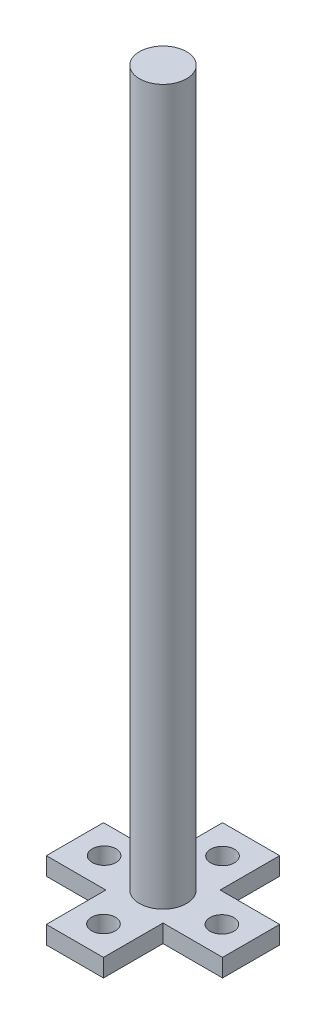
ISO-10303-21;
HEADER;
FILE_DESCRIPTION(('STEP AP214'),'2;1');
FILE_NAME('part.step','',(''),(''),'','','');
FILE_SCHEMA(('AUTOMOTIVE_DESIGN { 1 0 10303 214 1 1 1 1 }'));
ENDSEC;
DATA;
#1=APPLICATION_CONTEXT('core data for automotive mechanical design processes');
#2=APPLICATION_PROTOCOL_DEFINITION('international standard','automotive_design',2000,#1);
#3=PRODUCT_CONTEXT('',#1,'mechanical');
#4=PRODUCT('Part','Part','',(#3));
#5=PRODUCT_RELATED_PRODUCT_CATEGORY('part','',(#4));
#6=PRODUCT_DEFINITION_FORMATION('','',#4);
#7=PRODUCT_DEFINITION_CONTEXT('part definition',#1,'design');
#8=PRODUCT_DEFINITION('design','',#6,#7);
#9=PRODUCT_DEFINITION_SHAPE('','',#8);
#10=(LENGTH_UNIT() NAMED_UNIT(*) SI_UNIT(.MILLI.,.METRE.));
#11=(NAMED_UNIT(*) PLANE_ANGLE_UNIT() SI_UNIT($,.RADIAN.));
#12=(NAMED_UNIT(*) SI_UNIT($,.STERADIAN.) SOLID_ANGLE_UNIT());
#13=UNCERTAINTY_MEASURE_WITH_UNIT(LENGTH_MEASURE(1.E-05),#10,'distance_accuracy_value','');
#14=(GEOMETRIC_REPRESENTATION_CONTEXT(3) GLOBAL_UNCERTAINTY_ASSIGNED_CONTEXT((#13)) GLOBAL_UNIT_ASSIGNED_CONTEXT((#10,
#11,#12)) REPRESENTATION_CONTEXT('',''));
#15=CARTESIAN_POINT('',(0.,0.,0.));
#16=DIRECTION('',(0.,0.,1.));
#17=DIRECTION('',(1.,0.,0.));
#18=AXIS2_PLACEMENT_3D('',#15,#16,#17);
#19=CARTESIAN_POINT('',(-14.8,3.,0.));
#20=DIRECTION('',(-1.,0.,0.));
#21=DIRECTION('',(0.,0.,1.));
#22=AXIS2_PLACEMENT_3D('',#19,#20,#21);
#23=PLANE('',#22);
#24=DIRECTION('',(0.,0.,-1.));
#25=VECTOR('',#24,1.);
#26=CARTESIAN_POINT('',(-14.8,0.,0.));
#27=LINE('',#26,#25);
#28=CARTESIAN_POINT('',(-14.8,0.,4.8));
#29=VERTEX_POINT('',#28);
#30=CARTESIAN_POINT('',(-14.8,0.,-4.8));
#31=VERTEX_POINT('',#30);
#32=EDGE_CURVE('E188',#29,#31,#27,.T.);
#33=ORIENTED_EDGE('',*,*,#32,.F.);
#34=DIRECTION('',(0.,-1.,0.));
#35=VECTOR('',#34,1.);
#36=CARTESIAN_POINT('',(-14.8,3.,4.8));
#37=LINE('',#36,#35);
#38=CARTESIAN_POINT('',(-14.8,3.,4.8));
#39=VERTEX_POINT('',#38);
#40=EDGE_CURVE('E11',#39,#29,#37,.T.);
#41=ORIENTED_EDGE('',*,*,#40,.F.);
#42=DIRECTION('',(0.,0.,-1.));
#43=VECTOR('',#42,1.);
#44=CARTESIAN_POINT('',(-14.8,3.,0.));
#45=LINE('',#44,#43);
#46=CARTESIAN_POINT('',(-14.8,3.,-4.8));
#47=VERTEX_POINT('',#46);
#48=EDGE_CURVE('E301',#39,#47,#45,.T.);
#49=ORIENTED_EDGE('',*,*,#48,.T.);
#50=DIRECTION('',(0.,-1.,0.));
#51=VECTOR('',#50,1.);
#52=CARTESIAN_POINT('',(-14.8,3.,-4.8));
#53=LINE('',#52,#51);
#54=EDGE_CURVE('E65',#47,#31,#53,.T.);
#55=ORIENTED_EDGE('',*,*,#54,.T.);
#56=EDGE_LOOP('',(#33,#41,#49,#55));
#57=FACE_BOUND('',#56,.T.);
#58=ADVANCED_FACE('F47',(#57),#23,.T.);
#59=CARTESIAN_POINT('',(0.,3.,4.8));
#60=DIRECTION('',(0.,0.,-1.));
#61=DIRECTION('',(-1.,0.,0.));
#62=AXIS2_PLACEMENT_3D('',#59,#60,#61);
#63=PLANE('',#62);
#64=DIRECTION('',(1.,0.,0.));
#65=VECTOR('',#64,1.);
#66=CARTESIAN_POINT('',(0.,0.,4.8));
#67=LINE('',#66,#65);
#68=CARTESIAN_POINT('',(-4.80000000000001,0.,4.8));
#69=VERTEX_POINT('',#68);
#70=EDGE_CURVE('E192',#29,#69,#67,.T.);
#71=ORIENTED_EDGE('',*,*,#70,.T.);
#72=DIRECTION('',(0.,-1.,0.));
#73=VECTOR('',#72,1.);
#74=CARTESIAN_POINT('',(-4.80000000000001,3.,4.8));
#75=LINE('',#74,#73);
#76=CARTESIAN_POINT('',(-4.80000000000001,3.,4.8));
#77=VERTEX_POINT('',#76);
#78=EDGE_CURVE('E57',#77,#69,#75,.T.);
#79=ORIENTED_EDGE('',*,*,#78,.F.);
#80=DIRECTION('',(1.,0.,0.));
#81=VECTOR('',#80,1.);
#82=CARTESIAN_POINT('',(0.,3.,4.8));
#83=LINE('',#82,#81);
#84=EDGE_CURVE('E297',#39,#77,#83,.T.);
#85=ORIENTED_EDGE('',*,*,#84,.F.);
#86=ORIENTED_EDGE('',*,*,#40,.T.);
#87=EDGE_LOOP('',(#71,#79,#85,#86));
#88=FACE_BOUND('',#87,.T.);
#89=ADVANCED_FACE('F282',(#88),#63,.F.);
#90=CARTESIAN_POINT('',(-4.80000000000001,3.,0.));
#91=DIRECTION('',(-1.,0.,0.));
#92=DIRECTION('',(0.,0.,1.));
#93=AXIS2_PLACEMENT_3D('',#90,#91,#92);
#94=PLANE('',#93);
#95=DIRECTION('',(0.,0.,-1.));
#96=VECTOR('',#95,1.);
#97=CARTESIAN_POINT('',(-4.80000000000001,0.,0.));
#98=LINE('',#97,#96);
#99=CARTESIAN_POINT('',(-4.80000000000001,0.,14.8));
#100=VERTEX_POINT('',#99);
#101=EDGE_CURVE('E196',#100,#69,#98,.T.);
#102=ORIENTED_EDGE('',*,*,#101,.F.);
#103=DIRECTION('',(0.,-1.,0.));
#104=VECTOR('',#103,1.);
#105=CARTESIAN_POINT('',(-4.80000000000001,3.,14.8));
#106=LINE('',#105,#104);
#107=CARTESIAN_POINT('',(-4.80000000000001,3.,14.8));
#108=VERTEX_POINT('',#107);
#109=EDGE_CURVE('E270',#108,#100,#106,.T.);
#110=ORIENTED_EDGE('',*,*,#109,.F.);
#111=DIRECTION('',(0.,0.,-1.));
#112=VECTOR('',#111,1.);
#113=CARTESIAN_POINT('',(-4.80000000000001,3.,0.));
#114=LINE('',#113,#112);
#115=EDGE_CURVE('E279',#108,#77,#114,.T.);
#116=ORIENTED_EDGE('',*,*,#115,.T.);
#117=ORIENTED_EDGE('',*,*,#78,.T.);
#118=EDGE_LOOP('',(#102,#110,#116,#117));
#119=FACE_BOUND('',#118,.T.);
#120=ADVANCED_FACE('F277',(#119),#94,.T.);
#121=CARTESIAN_POINT('',(0.,3.,14.8));
#122=DIRECTION('',(0.,0.,-1.));
#123=DIRECTION('',(-1.,0.,0.));
#124=AXIS2_PLACEMENT_3D('',#121,#122,#123);
#125=PLANE('',#124);
#126=DIRECTION('',(1.,0.,0.));
#127=VECTOR('',#126,1.);
#128=CARTESIAN_POINT('',(0.,0.,14.8));
#129=LINE('',#128,#127);
#130=CARTESIAN_POINT('',(4.79999999999999,0.,14.8));
#131=VERTEX_POINT('',#130);
#132=EDGE_CURVE('E200',#100,#131,#129,.T.);
#133=ORIENTED_EDGE('',*,*,#132,.T.);
#134=DIRECTION('',(0.,-1.,0.));
#135=VECTOR('',#134,1.);
#136=CARTESIAN_POINT('',(4.79999999999999,3.,14.8));
#137=LINE('',#136,#135);
#138=CARTESIAN_POINT('',(4.79999999999999,3.,14.8));
#139=VERTEX_POINT('',#138);
#140=EDGE_CURVE('E266',#139,#131,#137,.T.);
#141=ORIENTED_EDGE('',*,*,#140,.F.);
#142=DIRECTION('',(1.,0.,0.));
#143=VECTOR('',#142,1.);
#144=CARTESIAN_POINT('',(0.,3.,14.8));
#145=LINE('',#144,#143);
#146=EDGE_CURVE('E292',#108,#139,#145,.T.);
#147=ORIENTED_EDGE('',*,*,#146,.F.);
#148=ORIENTED_EDGE('',*,*,#109,.T.);
#149=EDGE_LOOP('',(#133,#141,#147,#148));
#150=FACE_BOUND('',#149,.T.);
#151=ADVANCED_FACE('F289',(#150),#125,.F.);
#152=CARTESIAN_POINT('',(4.79999999999999,3.,0.));
#153=DIRECTION('',(-1.,0.,0.));
#154=DIRECTION('',(0.,0.,1.));
#155=AXIS2_PLACEMENT_3D('',#152,#153,#154);
#156=PLANE('',#155);
#157=DIRECTION('',(0.,0.,-1.));
#158=VECTOR('',#157,1.);
#159=CARTESIAN_POINT('',(4.79999999999999,0.,0.));
#160=LINE('',#159,#158);
#161=CARTESIAN_POINT('',(4.79999999999999,0.,4.8));
#162=VERTEX_POINT('',#161);
#163=EDGE_CURVE('E204',#131,#162,#160,.T.);
#164=ORIENTED_EDGE('',*,*,#163,.T.);
#165=DIRECTION('',(0.,-1.,0.));
#166=VECTOR('',#165,1.);
#167=CARTESIAN_POINT('',(4.79999999999999,3.,4.8));
#168=LINE('',#167,#166);
#169=CARTESIAN_POINT('',(4.79999999999999,3.,4.8));
#170=VERTEX_POINT('',#169);
#171=EDGE_CURVE('E262',#170,#162,#168,.T.);
#172=ORIENTED_EDGE('',*,*,#171,.F.);
#173=DIRECTION('',(0.,0.,-1.));
#174=VECTOR('',#173,1.);
#175=CARTESIAN_POINT('',(4.79999999999999,3.,0.));
#176=LINE('',#175,#174);
#177=EDGE_CURVE('E295',#139,#170,#176,.T.);
#178=ORIENTED_EDGE('',*,*,#177,.F.);
#179=ORIENTED_EDGE('',*,*,#140,.T.);
#180=EDGE_LOOP('',(#164,#172,#178,#179));
#181=FACE_BOUND('',#180,.T.);
#182=ADVANCED_FACE('F346',(#181),#156,.F.);
#183=CARTESIAN_POINT('',(0.,3.,4.8));
#184=DIRECTION('',(0.,0.,-1.));
#185=DIRECTION('',(-1.,0.,0.));
#186=AXIS2_PLACEMENT_3D('',#183,#184,#185);
#187=PLANE('',#186);
#188=DIRECTION('',(1.,0.,0.));
#189=VECTOR('',#188,1.);
#190=CARTESIAN_POINT('',(0.,0.,4.8));
#191=LINE('',#190,#189);
#192=CARTESIAN_POINT('',(14.8,0.,4.8));
#193=VERTEX_POINT('',#192);
#194=EDGE_CURVE('E208',#162,#193,#191,.T.);
#195=ORIENTED_EDGE('',*,*,#194,.T.);
#196=DIRECTION('',(0.,-1.,0.));
#197=VECTOR('',#196,1.);
#198=CARTESIAN_POINT('',(14.8,3.,4.8));
#199=LINE('',#198,#197);
#200=CARTESIAN_POINT('',(14.8,3.,4.8));
#201=VERTEX_POINT('',#200);
#202=EDGE_CURVE('E258',#201,#193,#199,.T.);
#203=ORIENTED_EDGE('',*,*,#202,.F.);
#204=DIRECTION('',(1.,0.,0.));
#205=VECTOR('',#204,1.);
#206=CARTESIAN_POINT('',(0.,3.,4.8));
#207=LINE('',#206,#205);
#208=EDGE_CURVE('E307',#170,#201,#207,.T.);
#209=ORIENTED_EDGE('',*,*,#208,.F.);
#210=ORIENTED_EDGE('',*,*,#171,.T.);
#211=EDGE_LOOP('',(#195,#203,#209,#210));
#212=FACE_BOUND('',#211,.T.);
#213=ADVANCED_FACE('F349',(#212),#187,.F.);
#214=CARTESIAN_POINT('',(14.8,3.,0.));
#215=DIRECTION('',(-1.,0.,0.));
#216=DIRECTION('',(0.,0.,1.));
#217=AXIS2_PLACEMENT_3D('',#214,#215,#216);
#218=PLANE('',#217);
#219=DIRECTION('',(0.,0.,-1.));
#220=VECTOR('',#219,1.);
#221=CARTESIAN_POINT('',(14.8,0.,0.));
#222=LINE('',#221,#220);
#223=CARTESIAN_POINT('',(14.8,0.,-4.8));
#224=VERTEX_POINT('',#223);
#225=EDGE_CURVE('E212',#193,#224,#222,.T.);
#226=ORIENTED_EDGE('',*,*,#225,.T.);
#227=DIRECTION('',(0.,-1.,0.));
#228=VECTOR('',#227,1.);
#229=CARTESIAN_POINT('',(14.8,3.,-4.8));
#230=LINE('',#229,#228);
#231=CARTESIAN_POINT('',(14.8,3.,-4.8));
#232=VERTEX_POINT('',#231);
#233=EDGE_CURVE('E255',#232,#224,#230,.T.);
#234=ORIENTED_EDGE('',*,*,#233,.F.);
#235=DIRECTION('',(0.,0.,-1.));
#236=VECTOR('',#235,1.);
#237=CARTESIAN_POINT('',(14.8,3.,0.));
#238=LINE('',#237,#236);
#239=EDGE_CURVE('E311',#201,#232,#238,.T.);
#240=ORIENTED_EDGE('',*,*,#239,.F.);
#241=ORIENTED_EDGE('',*,*,#202,.T.);
#242=EDGE_LOOP('',(#226,#234,#240,#241));
#243=FACE_BOUND('',#242,.T.);
#244=ADVANCED_FACE('F324',(#243),#218,.F.);
#245=CARTESIAN_POINT('',(0.,3.,-4.8));
#246=DIRECTION('',(0.,0.,-1.));
#247=DIRECTION('',(-1.,0.,0.));
#248=AXIS2_PLACEMENT_3D('',#245,#246,#247);
#249=PLANE('',#248);
#250=DIRECTION('',(1.,0.,0.));
#251=VECTOR('',#250,1.);
#252=CARTESIAN_POINT('',(0.,0.,-4.8));
#253=LINE('',#252,#251);
#254=CARTESIAN_POINT('',(4.79999999999999,0.,-4.8));
#255=VERTEX_POINT('',#254);
#256=EDGE_CURVE('E216',#255,#224,#253,.T.);
#257=ORIENTED_EDGE('',*,*,#256,.F.);
#258=DIRECTION('',(0.,-1.,0.));
#259=VECTOR('',#258,1.);
#260=CARTESIAN_POINT('',(4.79999999999999,3.,-4.8));
#261=LINE('',#260,#259);
#262=CARTESIAN_POINT('',(4.79999999999999,3.,-4.8));
#263=VERTEX_POINT('',#262);
#264=EDGE_CURVE('E252',#263,#255,#261,.T.);
#265=ORIENTED_EDGE('',*,*,#264,.F.);
#266=DIRECTION('',(1.,0.,0.));
#267=VECTOR('',#266,1.);
#268=CARTESIAN_POINT('',(0.,3.,-4.8));
#269=LINE('',#268,#267);
#270=EDGE_CURVE('E314',#263,#232,#269,.T.);
#271=ORIENTED_EDGE('',*,*,#270,.T.);
#272=ORIENTED_EDGE('',*,*,#233,.T.);
#273=EDGE_LOOP('',(#257,#265,#271,#272));
#274=FACE_BOUND('',#273,.T.);
#275=ADVANCED_FACE('F320',(#274),#249,.T.);
#276=CARTESIAN_POINT('',(4.79999999999999,3.,0.));
#277=DIRECTION('',(-1.,0.,0.));
#278=DIRECTION('',(0.,0.,1.));
#279=AXIS2_PLACEMENT_3D('',#276,#277,#278);
#280=PLANE('',#279);
#281=DIRECTION('',(0.,0.,-1.));
#282=VECTOR('',#281,1.);
#283=CARTESIAN_POINT('',(4.79999999999999,0.,0.));
#284=LINE('',#283,#282);
#285=CARTESIAN_POINT('',(4.79999999999999,0.,-14.8));
#286=VERTEX_POINT('',#285);
#287=EDGE_CURVE('E220',#255,#286,#284,.T.);
#288=ORIENTED_EDGE('',*,*,#287,.T.);
#289=DIRECTION('',(0.,-1.,0.));
#290=VECTOR('',#289,1.);
#291=CARTESIAN_POINT('',(4.79999999999999,3.,-14.8));
#292=LINE('',#291,#290);
#293=CARTESIAN_POINT('',(4.79999999999999,3.,-14.8));
#294=VERTEX_POINT('',#293);
#295=EDGE_CURVE('E149',#294,#286,#292,.T.);
#296=ORIENTED_EDGE('',*,*,#295,.F.);
#297=DIRECTION('',(0.,0.,-1.));
#298=VECTOR('',#297,1.);
#299=CARTESIAN_POINT('',(4.79999999999999,3.,0.));
#300=LINE('',#299,#298);
#301=EDGE_CURVE('E160',#263,#294,#300,.T.);
#302=ORIENTED_EDGE('',*,*,#301,.F.);
#303=ORIENTED_EDGE('',*,*,#264,.T.);
#304=EDGE_LOOP('',(#288,#296,#302,#303));
#305=FACE_BOUND('',#304,.T.);
#306=ADVANCED_FACE('F327',(#305),#280,.F.);
#307=CARTESIAN_POINT('',(0.,3.,-14.8));
#308=DIRECTION('',(0.,0.,-1.));
#309=DIRECTION('',(-1.,0.,0.));
#310=AXIS2_PLACEMENT_3D('',#307,#308,#309);
#311=PLANE('',#310);
#312=DIRECTION('',(1.,0.,0.));
#313=VECTOR('',#312,1.);
#314=CARTESIAN_POINT('',(0.,0.,-14.8));
#315=LINE('',#314,#313);
#316=CARTESIAN_POINT('',(-4.80000000000001,0.,-14.8));
#317=VERTEX_POINT('',#316);
#318=EDGE_CURVE('E144',#317,#286,#315,.T.);
#319=ORIENTED_EDGE('',*,*,#318,.F.);
#320=DIRECTION('',(0.,-1.,0.));
#321=VECTOR('',#320,1.);
#322=CARTESIAN_POINT('',(-4.80000000000001,3.,-14.8));
#323=LINE('',#322,#321);
#324=CARTESIAN_POINT('',(-4.80000000000001,3.,-14.8));
#325=VERTEX_POINT('',#324);
#326=EDGE_CURVE('E139',#325,#317,#323,.T.);
#327=ORIENTED_EDGE('',*,*,#326,.F.);
#328=DIRECTION('',(1.,0.,0.));
#329=VECTOR('',#328,1.);
#330=CARTESIAN_POINT('',(0.,3.,-14.8));
#331=LINE('',#330,#329);
#332=EDGE_CURVE('E142',#325,#294,#331,.T.);
#333=ORIENTED_EDGE('',*,*,#332,.T.);
#334=ORIENTED_EDGE('',*,*,#295,.T.);
#335=EDGE_LOOP('',(#319,#327,#333,#334));
#336=FACE_BOUND('',#335,.T.);
#337=ADVANCED_FACE('F141',(#336),#311,.T.);
#338=CARTESIAN_POINT('',(-4.80000000000001,3.,0.));
#339=DIRECTION('',(-1.,0.,0.));
#340=DIRECTION('',(0.,0.,1.));
#341=AXIS2_PLACEMENT_3D('',#338,#339,#340);
#342=PLANE('',#341);
#343=DIRECTION('',(0.,0.,-1.));
#344=VECTOR('',#343,1.);
#345=CARTESIAN_POINT('',(-4.80000000000001,0.,0.));
#346=LINE('',#345,#344);
#347=CARTESIAN_POINT('',(-4.80000000000001,0.,-4.8));
#348=VERTEX_POINT('',#347);
#349=EDGE_CURVE('E226',#348,#317,#346,.T.);
#350=ORIENTED_EDGE('',*,*,#349,.F.);
#351=DIRECTION('',(0.,-1.,0.));
#352=VECTOR('',#351,1.);
#353=CARTESIAN_POINT('',(-4.80000000000001,3.,-4.8));
#354=LINE('',#353,#352);
#355=CARTESIAN_POINT('',(-4.80000000000001,3.,-4.8));
#356=VERTEX_POINT('',#355);
#357=EDGE_CURVE('E102',#356,#348,#354,.T.);
#358=ORIENTED_EDGE('',*,*,#357,.F.);
#359=DIRECTION('',(0.,0.,-1.));
#360=VECTOR('',#359,1.);
#361=CARTESIAN_POINT('',(-4.80000000000001,3.,0.));
#362=LINE('',#361,#360);
#363=EDGE_CURVE('E157',#356,#325,#362,.T.);
#364=ORIENTED_EDGE('',*,*,#363,.T.);
#365=ORIENTED_EDGE('',*,*,#326,.T.);
#366=EDGE_LOOP('',(#350,#358,#364,#365));
#367=FACE_BOUND('',#366,.T.);
#368=ADVANCED_FACE('F164',(#367),#342,.T.);
#369=CARTESIAN_POINT('',(9.94644047395354,3.,0.0535595260516415));
#370=DIRECTION('',(0.,-1.,0.));
#371=DIRECTION('',(0.,0.,-1.));
#372=AXIS2_PLACEMENT_3D('',#369,#370,#371);
#373=CYLINDRICAL_SURFACE('',#372,2.);
#374=CARTESIAN_POINT('',(9.94644047395354,3.,0.0535595260516415));
#375=DIRECTION('',(0.,1.,0.));
#376=DIRECTION('',(0.,0.,1.));
#377=AXIS2_PLACEMENT_3D('',#374,#375,#376);
#378=CIRCLE('',#377,2.);
#379=CARTESIAN_POINT('',(9.94644047395354,3.,2.05355952605164));
#380=VERTEX_POINT('',#379);
#381=EDGE_CURVE('E176',#380,#380,#378,.T.);
#382=ORIENTED_EDGE('',*,*,#381,.T.);
#383=EDGE_LOOP('',(#382));
#384=FACE_BOUND('',#383,.T.);
#385=CARTESIAN_POINT('',(9.94644047395354,0.,0.0535595260516415));
#386=DIRECTION('',(0.,1.,0.));
#387=DIRECTION('',(0.,0.,1.));
#388=AXIS2_PLACEMENT_3D('',#385,#386,#387);
#389=CIRCLE('',#388,2.);
#390=CARTESIAN_POINT('',(9.94644047395354,0.,2.05355952605164));
#391=VERTEX_POINT('',#390);
#392=EDGE_CURVE('E237',#391,#391,#389,.T.);
#393=ORIENTED_EDGE('',*,*,#392,.F.);
#394=EDGE_LOOP('',(#393));
#395=FACE_BOUND('',#394,.T.);
#396=ADVANCED_FACE('F384',(#384,#395),#373,.F.);
#397=CARTESIAN_POINT('',(0.0535595260516067,3.,-9.94644047395354));
#398=DIRECTION('',(0.,-1.,0.));
#399=DIRECTION('',(0.,0.,-1.));
#400=AXIS2_PLACEMENT_3D('',#397,#398,#399);
#401=CYLINDRICAL_SURFACE('',#400,2.);
#402=CARTESIAN_POINT('',(0.0535595260516067,3.,-9.94644047395354));
#403=DIRECTION('',(0.,1.,0.));
#404=DIRECTION('',(0.,0.,1.));
#405=AXIS2_PLACEMENT_3D('',#402,#403,#404);
#406=CIRCLE('',#405,2.);
#407=CARTESIAN_POINT('',(0.0535595260516067,3.,-7.94644047395355));
#408=VERTEX_POINT('',#407);
#409=EDGE_CURVE('E169',#408,#408,#406,.T.);
#410=ORIENTED_EDGE('',*,*,#409,.T.);
#411=EDGE_LOOP('',(#410));
#412=FACE_BOUND('',#411,.T.);
#413=CARTESIAN_POINT('',(0.0535595260516067,0.,-9.94644047395354));
#414=DIRECTION('',(0.,1.,0.));
#415=DIRECTION('',(0.,0.,1.));
#416=AXIS2_PLACEMENT_3D('',#413,#414,#415);
#417=CIRCLE('',#416,2.);
#418=CARTESIAN_POINT('',(0.0535595260516067,0.,-7.94644047395355));
#419=VERTEX_POINT('',#418);
#420=EDGE_CURVE('E233',#419,#419,#417,.T.);
#421=ORIENTED_EDGE('',*,*,#420,.F.);
#422=EDGE_LOOP('',(#421));
#423=FACE_BOUND('',#422,.T.);
#424=ADVANCED_FACE('F393',(#412,#423),#401,.F.);
#425=CARTESIAN_POINT('',(0.,3.,-4.8));
#426=DIRECTION('',(0.,0.,-1.));
#427=DIRECTION('',(-1.,0.,0.));
#428=AXIS2_PLACEMENT_3D('',#425,#426,#427);
#429=PLANE('',#428);
#430=DIRECTION('',(1.,0.,0.));
#431=VECTOR('',#430,1.);
#432=CARTESIAN_POINT('',(0.,0.,-4.8));
#433=LINE('',#432,#431);
#434=EDGE_CURVE('E229',#31,#348,#433,.T.);
#435=ORIENTED_EDGE('',*,*,#434,.F.);
#436=ORIENTED_EDGE('',*,*,#54,.F.);
#437=DIRECTION('',(1.,0.,0.));
#438=VECTOR('',#437,1.);
#439=CARTESIAN_POINT('',(0.,3.,-4.8));
#440=LINE('',#439,#438);
#441=EDGE_CURVE('E166',#47,#356,#440,.T.);
#442=ORIENTED_EDGE('',*,*,#441,.T.);
#443=ORIENTED_EDGE('',*,*,#357,.T.);
#444=EDGE_LOOP('',(#435,#436,#442,#443));
#445=FACE_BOUND('',#444,.T.);
#446=ADVANCED_FACE('F403',(#445),#429,.T.);
#447=CARTESIAN_POINT('',(-9.94644047395354,3.,-0.053559526051572));
#448=DIRECTION('',(0.,-1.,0.));
#449=DIRECTION('',(0.,0.,-1.));
#450=AXIS2_PLACEMENT_3D('',#447,#448,#449);
#451=CYLINDRICAL_SURFACE('',#450,2.);
#452=CARTESIAN_POINT('',(-9.94644047395354,3.,-0.053559526051572));
#453=DIRECTION('',(0.,1.,0.));
#454=DIRECTION('',(0.,0.,1.));
#455=AXIS2_PLACEMENT_3D('',#452,#453,#454);
#456=CIRCLE('',#455,2.);
#457=CARTESIAN_POINT('',(-9.94644047395354,3.,1.94644047394843));
#458=VERTEX_POINT('',#457);
#459=EDGE_CURVE('E245',#458,#458,#456,.T.);
#460=ORIENTED_EDGE('',*,*,#459,.T.);
#461=EDGE_LOOP('',(#460));
#462=FACE_BOUND('',#461,.T.);
#463=CARTESIAN_POINT('',(-9.94644047395354,0.,-0.053559526051572));
#464=DIRECTION('',(0.,1.,0.));
#465=DIRECTION('',(0.,0.,1.));
#466=AXIS2_PLACEMENT_3D('',#463,#464,#465);
#467=CIRCLE('',#466,2.);
#468=CARTESIAN_POINT('',(-9.94644047395354,0.,1.94644047394843));
#469=VERTEX_POINT('',#468);
#470=EDGE_CURVE('E184',#469,#469,#467,.T.);
#471=ORIENTED_EDGE('',*,*,#470,.F.);
#472=EDGE_LOOP('',(#471));
#473=FACE_BOUND('',#472,.T.);
#474=ADVANCED_FACE('F49',(#462,#473),#451,.F.);
#475=CARTESIAN_POINT('',(-0.0535595260516762,3.,9.94644047395354));
#476=DIRECTION('',(0.,-1.,0.));
#477=DIRECTION('',(0.,0.,-1.));
#478=AXIS2_PLACEMENT_3D('',#475,#476,#477);
#479=CYLINDRICAL_SURFACE('',#478,2.);
#480=CARTESIAN_POINT('',(-0.0535595260516762,3.,9.94644047395354));
#481=DIRECTION('',(0.,1.,0.));
#482=DIRECTION('',(0.,0.,1.));
#483=AXIS2_PLACEMENT_3D('',#480,#481,#482);
#484=CIRCLE('',#483,2.);
#485=CARTESIAN_POINT('',(-0.0535595260516762,3.,11.9464404739535));
#486=VERTEX_POINT('',#485);
#487=EDGE_CURVE('E180',#486,#486,#484,.T.);
#488=ORIENTED_EDGE('',*,*,#487,.T.);
#489=EDGE_LOOP('',(#488));
#490=FACE_BOUND('',#489,.T.);
#491=CARTESIAN_POINT('',(-0.0535595260516762,0.,9.94644047395354));
#492=DIRECTION('',(0.,1.,0.));
#493=DIRECTION('',(0.,0.,1.));
#494=AXIS2_PLACEMENT_3D('',#491,#492,#493);
#495=CIRCLE('',#494,2.);
#496=CARTESIAN_POINT('',(-0.0535595260516762,0.,11.9464404739535));
#497=VERTEX_POINT('',#496);
#498=EDGE_CURVE('E241',#497,#497,#495,.T.);
#499=ORIENTED_EDGE('',*,*,#498,.F.);
#500=EDGE_LOOP('',(#499));
#501=FACE_BOUND('',#500,.T.);
#502=ADVANCED_FACE('F421',(#490,#501),#479,.F.);
#503=CARTESIAN_POINT('',(0.,3.,0.));
#504=DIRECTION('',(0.,1.,0.));
#505=DIRECTION('',(0.,0.,1.));
#506=AXIS2_PLACEMENT_3D('',#503,#504,#505);
#507=PLANE('',#506);
#508=CARTESIAN_POINT('',(0.,3.,0.));
#509=DIRECTION('',(0.,1.,0.));
#510=DIRECTION('',(0.,0.,1.));
#511=AXIS2_PLACEMENT_3D('',#508,#509,#510);
#512=CIRCLE('',#511,3.95);
#513=CARTESIAN_POINT('',(0.,3.,3.95));
#514=VERTEX_POINT('',#513);
#515=EDGE_CURVE('E492',#514,#514,#512,.T.);
#516=ORIENTED_EDGE('',*,*,#515,.F.);
#517=EDGE_LOOP('',(#516));
#518=FACE_BOUND('',#517,.T.);
#519=ORIENTED_EDGE('',*,*,#459,.F.);
#520=EDGE_LOOP('',(#519));
#521=FACE_BOUND('',#520,.T.);
#522=ORIENTED_EDGE('',*,*,#48,.F.);
#523=ORIENTED_EDGE('',*,*,#84,.T.);
#524=ORIENTED_EDGE('',*,*,#115,.F.);
#525=ORIENTED_EDGE('',*,*,#146,.T.);
#526=ORIENTED_EDGE('',*,*,#177,.T.);
#527=ORIENTED_EDGE('',*,*,#208,.T.);
#528=ORIENTED_EDGE('',*,*,#239,.T.);
#529=ORIENTED_EDGE('',*,*,#270,.F.);
#530=ORIENTED_EDGE('',*,*,#301,.T.);
#531=ORIENTED_EDGE('',*,*,#332,.F.);
#532=ORIENTED_EDGE('',*,*,#363,.F.);
#533=ORIENTED_EDGE('',*,*,#441,.F.);
#534=EDGE_LOOP('',(#522,#523,#524,#525,#526,#527,#528,#529,#530,#531,#532,#533));
#535=FACE_BOUND('',#534,.T.);
#536=ORIENTED_EDGE('',*,*,#409,.F.);
#537=EDGE_LOOP('',(#536));
#538=FACE_BOUND('',#537,.T.);
#539=ORIENTED_EDGE('',*,*,#381,.F.);
#540=EDGE_LOOP('',(#539));
#541=FACE_BOUND('',#540,.T.);
#542=ORIENTED_EDGE('',*,*,#487,.F.);
#543=EDGE_LOOP('',(#542));
#544=FACE_BOUND('',#543,.T.);
#545=ADVANCED_FACE('F154',(#518,#521,#535,#538,#541,#544),#507,.T.);
#546=CARTESIAN_POINT('',(0.,0.,0.));
#547=DIRECTION('',(0.,1.,0.));
#548=DIRECTION('',(0.,0.,1.));
#549=AXIS2_PLACEMENT_3D('',#546,#547,#548);
#550=PLANE('',#549);
#551=ORIENTED_EDGE('',*,*,#470,.T.);
#552=EDGE_LOOP('',(#551));
#553=FACE_BOUND('',#552,.T.);
#554=ORIENTED_EDGE('',*,*,#32,.T.);
#555=ORIENTED_EDGE('',*,*,#434,.T.);
#556=ORIENTED_EDGE('',*,*,#349,.T.);
#557=ORIENTED_EDGE('',*,*,#318,.T.);
#558=ORIENTED_EDGE('',*,*,#287,.F.);
#559=ORIENTED_EDGE('',*,*,#256,.T.);
#560=ORIENTED_EDGE('',*,*,#225,.F.);
#561=ORIENTED_EDGE('',*,*,#194,.F.);
#562=ORIENTED_EDGE('',*,*,#163,.F.);
#563=ORIENTED_EDGE('',*,*,#132,.F.);
#564=ORIENTED_EDGE('',*,*,#101,.T.);
#565=ORIENTED_EDGE('',*,*,#70,.F.);
#566=EDGE_LOOP('',(#554,#555,#556,#557,#558,#559,#560,#561,#562,#563,#564,#565));
#567=FACE_BOUND('',#566,.T.);
#568=ORIENTED_EDGE('',*,*,#420,.T.);
#569=EDGE_LOOP('',(#568));
#570=FACE_BOUND('',#569,.T.);
#571=ORIENTED_EDGE('',*,*,#392,.T.);
#572=EDGE_LOOP('',(#571));
#573=FACE_BOUND('',#572,.T.);
#574=ORIENTED_EDGE('',*,*,#498,.T.);
#575=EDGE_LOOP('',(#574));
#576=FACE_BOUND('',#575,.T.);
#577=ADVANCED_FACE('F285',(#553,#567,#570,#573,#576),#550,.F.);
#578=CARTESIAN_POINT('',(0.,123.,0.));
#579=DIRECTION('',(0.,-1.,0.));
#580=DIRECTION('',(0.,0.,-1.));
#581=AXIS2_PLACEMENT_3D('',#578,#579,#580);
#582=CYLINDRICAL_SURFACE('',#581,3.95);
#583=CARTESIAN_POINT('',(0.,123.,0.));
#584=DIRECTION('',(0.,1.,0.));
#585=DIRECTION('',(0.,0.,1.));
#586=AXIS2_PLACEMENT_3D('',#583,#584,#585);
#587=CIRCLE('',#586,3.95);
#588=CARTESIAN_POINT('',(0.,123.,3.95));
#589=VERTEX_POINT('',#588);
#590=EDGE_CURVE('E189',#589,#589,#587,.T.);
#591=ORIENTED_EDGE('',*,*,#590,.F.);
#592=EDGE_LOOP('',(#591));
#593=FACE_BOUND('',#592,.T.);
#594=ORIENTED_EDGE('',*,*,#515,.T.);
#595=EDGE_LOOP('',(#594));
#596=FACE_BOUND('',#595,.T.);
#597=ADVANCED_FACE('F458',(#593,#596),#582,.T.);
#598=CARTESIAN_POINT('',(0.,123.,0.));
#599=DIRECTION('',(0.,1.,0.));
#600=DIRECTION('',(0.,0.,1.));
#601=AXIS2_PLACEMENT_3D('',#598,#599,#600);
#602=PLANE('',#601);
#603=ORIENTED_EDGE('',*,*,#590,.T.);
#604=EDGE_LOOP('',(#603));
#605=FACE_BOUND('',#604,.T.);
#606=ADVANCED_FACE('F476',(#605),#602,.T.);
#607=CLOSED_SHELL('',(#58,#89,#120,#151,#182,#213,#244,#275,#306,#337,#368,#396,#424,#446,#474,
#502,#545,#577,#597,#606));
#608=MANIFOLD_SOLID_BREP('B2',#607);
#609=ADVANCED_BREP_SHAPE_REPRESENTATION('',(#18,#608),#14);
#610=SHAPE_DEFINITION_REPRESENTATION(#9,#609);
ENDSEC;
END-ISO-10303-21;
